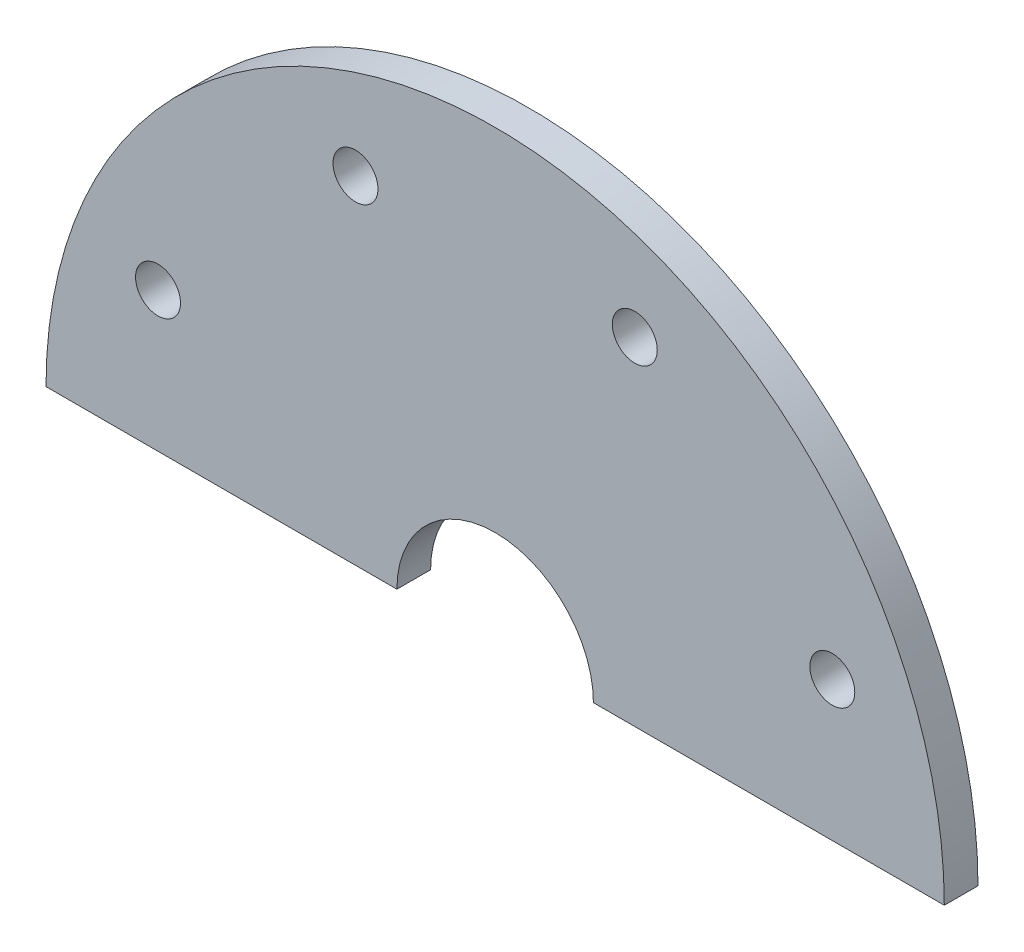
ISO-10303-21;
HEADER;
FILE_DESCRIPTION(('STEP AP214'),'2;1');
FILE_NAME('part.step','',(''),(''),'','','');
FILE_SCHEMA(('AUTOMOTIVE_DESIGN { 1 0 10303 214 1 1 1 1 }'));
ENDSEC;
DATA;
#1=APPLICATION_CONTEXT('core data for automotive mechanical design processes');
#2=APPLICATION_PROTOCOL_DEFINITION('international standard','automotive_design',2000,#1);
#3=PRODUCT_CONTEXT('',#1,'mechanical');
#4=PRODUCT('Part','Part','',(#3));
#5=PRODUCT_RELATED_PRODUCT_CATEGORY('part','',(#4));
#6=PRODUCT_DEFINITION_FORMATION('','',#4);
#7=PRODUCT_DEFINITION_CONTEXT('part definition',#1,'design');
#8=PRODUCT_DEFINITION('design','',#6,#7);
#9=PRODUCT_DEFINITION_SHAPE('','',#8);
#10=(LENGTH_UNIT() NAMED_UNIT(*) SI_UNIT(.MILLI.,.METRE.));
#11=(NAMED_UNIT(*) PLANE_ANGLE_UNIT() SI_UNIT($,.RADIAN.));
#12=(NAMED_UNIT(*) SI_UNIT($,.STERADIAN.) SOLID_ANGLE_UNIT());
#13=UNCERTAINTY_MEASURE_WITH_UNIT(LENGTH_MEASURE(1.E-05),#10,'distance_accuracy_value','');
#14=(GEOMETRIC_REPRESENTATION_CONTEXT(3) GLOBAL_UNCERTAINTY_ASSIGNED_CONTEXT((#13)) GLOBAL_UNIT_ASSIGNED_CONTEXT((#10,
#11,#12)) REPRESENTATION_CONTEXT('',''));
#15=CARTESIAN_POINT('',(0.,0.,0.));
#16=DIRECTION('',(0.,0.,1.));
#17=DIRECTION('',(1.,0.,0.));
#18=AXIS2_PLACEMENT_3D('',#15,#16,#17);
#19=CARTESIAN_POINT('',(0.,0.,6.));
#20=DIRECTION('',(0.,0.,1.));
#21=DIRECTION('',(1.,0.,0.));
#22=AXIS2_PLACEMENT_3D('',#19,#20,#21);
#23=PLANE('',#22);
#24=CARTESIAN_POINT('',(60.0521696132336,24.8744231037309,6.));
#25=DIRECTION('',(0.,0.,1.));
#26=DIRECTION('',(1.,0.,0.));
#27=AXIS2_PLACEMENT_3D('',#24,#25,#26);
#28=CIRCLE('',#27,4.);
#29=CARTESIAN_POINT('',(64.0521696132336,24.8744231037309,6.));
#30=VERTEX_POINT('',#29);
#31=EDGE_CURVE('E122',#30,#30,#28,.T.);
#32=ORIENTED_EDGE('',*,*,#31,.F.);
#33=EDGE_LOOP('',(#32));
#34=FACE_BOUND('',#33,.T.);
#35=CARTESIAN_POINT('',(-24.8744231037305,60.0521696132338,6.));
#36=DIRECTION('',(0.,0.,1.));
#37=DIRECTION('',(-1.,0.,0.));
#38=AXIS2_PLACEMENT_3D('',#35,#36,#37);
#39=CIRCLE('',#38,4.);
#40=CARTESIAN_POINT('',(-28.8744231037305,60.0521696132338,6.));
#41=VERTEX_POINT('',#40);
#42=EDGE_CURVE('E101',#41,#41,#39,.T.);
#43=ORIENTED_EDGE('',*,*,#42,.F.);
#44=EDGE_LOOP('',(#43));
#45=FACE_BOUND('',#44,.T.);
#46=CARTESIAN_POINT('',(0.,0.,6.));
#47=DIRECTION('',(0.,0.,1.));
#48=DIRECTION('',(1.,0.,0.));
#49=AXIS2_PLACEMENT_3D('',#46,#47,#48);
#50=CIRCLE('',#49,80.);
#51=CARTESIAN_POINT('',(80.,0.,6.));
#52=VERTEX_POINT('',#51);
#53=CARTESIAN_POINT('',(-80.,0.,6.));
#54=VERTEX_POINT('',#53);
#55=EDGE_CURVE('E86',#52,#54,#50,.T.);
#56=ORIENTED_EDGE('',*,*,#55,.T.);
#57=DIRECTION('',(1.,0.,0.));
#58=VECTOR('',#57,1.);
#59=CARTESIAN_POINT('',(-80.,0.,6.));
#60=LINE('',#59,#58);
#61=CARTESIAN_POINT('',(-17.5,0.,6.));
#62=VERTEX_POINT('',#61);
#63=EDGE_CURVE('E81',#54,#62,#60,.T.);
#64=ORIENTED_EDGE('',*,*,#63,.T.);
#65=CARTESIAN_POINT('',(0.,0.,6.));
#66=DIRECTION('',(0.,0.,-1.));
#67=DIRECTION('',(1.,0.,0.));
#68=AXIS2_PLACEMENT_3D('',#65,#66,#67);
#69=CIRCLE('',#68,17.5);
#70=CARTESIAN_POINT('',(17.5,0.,6.));
#71=VERTEX_POINT('',#70);
#72=EDGE_CURVE('E84',#62,#71,#69,.T.);
#73=ORIENTED_EDGE('',*,*,#72,.T.);
#74=DIRECTION('',(1.,0.,0.));
#75=VECTOR('',#74,1.);
#76=CARTESIAN_POINT('',(17.5,0.,6.));
#77=LINE('',#76,#75);
#78=EDGE_CURVE('E51',#71,#52,#77,.T.);
#79=ORIENTED_EDGE('',*,*,#78,.T.);
#80=EDGE_LOOP('',(#56,#64,#73,#79));
#81=FACE_BOUND('',#80,.T.);
#82=CARTESIAN_POINT('',(24.8744231037305,60.0521696132338,6.));
#83=DIRECTION('',(0.,0.,1.));
#84=DIRECTION('',(1.,0.,0.));
#85=AXIS2_PLACEMENT_3D('',#82,#83,#84);
#86=CIRCLE('',#85,4.);
#87=CARTESIAN_POINT('',(28.8744231037305,60.0521696132338,6.));
#88=VERTEX_POINT('',#87);
#89=EDGE_CURVE('E116',#88,#88,#86,.T.);
#90=ORIENTED_EDGE('',*,*,#89,.F.);
#91=EDGE_LOOP('',(#90));
#92=FACE_BOUND('',#91,.T.);
#93=CARTESIAN_POINT('',(-60.0521696132336,24.8744231037309,6.));
#94=DIRECTION('',(0.,0.,1.));
#95=DIRECTION('',(1.,0.,0.));
#96=AXIS2_PLACEMENT_3D('',#93,#94,#95);
#97=CIRCLE('',#96,4.00000000000001);
#98=CARTESIAN_POINT('',(-56.0521696132336,24.8744231037309,6.));
#99=VERTEX_POINT('',#98);
#100=EDGE_CURVE('E128',#99,#99,#97,.T.);
#101=ORIENTED_EDGE('',*,*,#100,.F.);
#102=EDGE_LOOP('',(#101));
#103=FACE_BOUND('',#102,.T.);
#104=ADVANCED_FACE('F34',(#34,#45,#81,#92,#103),#23,.T.);
#105=CARTESIAN_POINT('',(0.,0.,0.));
#106=DIRECTION('',(0.,0.,1.));
#107=DIRECTION('',(1.,0.,0.));
#108=AXIS2_PLACEMENT_3D('',#105,#106,#107);
#109=PLANE('',#108);
#110=CARTESIAN_POINT('',(0.,0.,0.));
#111=DIRECTION('',(0.,0.,1.));
#112=DIRECTION('',(1.,0.,0.));
#113=AXIS2_PLACEMENT_3D('',#110,#111,#112);
#114=CIRCLE('',#113,80.);
#115=CARTESIAN_POINT('',(80.,0.,0.));
#116=VERTEX_POINT('',#115);
#117=CARTESIAN_POINT('',(-80.,0.,0.));
#118=VERTEX_POINT('',#117);
#119=EDGE_CURVE('E98',#116,#118,#114,.T.);
#120=ORIENTED_EDGE('',*,*,#119,.F.);
#121=DIRECTION('',(1.,0.,0.));
#122=VECTOR('',#121,1.);
#123=CARTESIAN_POINT('',(17.5,0.,0.));
#124=LINE('',#123,#122);
#125=CARTESIAN_POINT('',(17.5,0.,0.));
#126=VERTEX_POINT('',#125);
#127=EDGE_CURVE('E74',#126,#116,#124,.T.);
#128=ORIENTED_EDGE('',*,*,#127,.F.);
#129=CARTESIAN_POINT('',(0.,0.,0.));
#130=DIRECTION('',(0.,0.,-1.));
#131=DIRECTION('',(1.,0.,0.));
#132=AXIS2_PLACEMENT_3D('',#129,#130,#131);
#133=CIRCLE('',#132,17.5);
#134=CARTESIAN_POINT('',(-17.5,0.,0.));
#135=VERTEX_POINT('',#134);
#136=EDGE_CURVE('E68',#135,#126,#133,.T.);
#137=ORIENTED_EDGE('',*,*,#136,.F.);
#138=DIRECTION('',(1.,0.,0.));
#139=VECTOR('',#138,1.);
#140=CARTESIAN_POINT('',(-80.,0.,0.));
#141=LINE('',#140,#139);
#142=EDGE_CURVE('E90',#118,#135,#141,.T.);
#143=ORIENTED_EDGE('',*,*,#142,.F.);
#144=EDGE_LOOP('',(#120,#128,#137,#143));
#145=FACE_BOUND('',#144,.T.);
#146=CARTESIAN_POINT('',(-24.8744231037305,60.0521696132338,0.));
#147=DIRECTION('',(0.,0.,1.));
#148=DIRECTION('',(-1.,0.,0.));
#149=AXIS2_PLACEMENT_3D('',#146,#147,#148);
#150=CIRCLE('',#149,4.);
#151=CARTESIAN_POINT('',(-28.8744231037305,60.0521696132338,0.));
#152=VERTEX_POINT('',#151);
#153=EDGE_CURVE('E113',#152,#152,#150,.T.);
#154=ORIENTED_EDGE('',*,*,#153,.T.);
#155=EDGE_LOOP('',(#154));
#156=FACE_BOUND('',#155,.T.);
#157=CARTESIAN_POINT('',(24.8744231037305,60.0521696132338,0.));
#158=DIRECTION('',(0.,0.,1.));
#159=DIRECTION('',(1.,0.,0.));
#160=AXIS2_PLACEMENT_3D('',#157,#158,#159);
#161=CIRCLE('',#160,4.);
#162=CARTESIAN_POINT('',(28.8744231037305,60.0521696132338,0.));
#163=VERTEX_POINT('',#162);
#164=EDGE_CURVE('E119',#163,#163,#161,.T.);
#165=ORIENTED_EDGE('',*,*,#164,.T.);
#166=EDGE_LOOP('',(#165));
#167=FACE_BOUND('',#166,.T.);
#168=CARTESIAN_POINT('',(60.0521696132336,24.8744231037309,0.));
#169=DIRECTION('',(0.,0.,1.));
#170=DIRECTION('',(1.,0.,0.));
#171=AXIS2_PLACEMENT_3D('',#168,#169,#170);
#172=CIRCLE('',#171,4.);
#173=CARTESIAN_POINT('',(64.0521696132336,24.8744231037309,0.));
#174=VERTEX_POINT('',#173);
#175=EDGE_CURVE('E125',#174,#174,#172,.T.);
#176=ORIENTED_EDGE('',*,*,#175,.T.);
#177=EDGE_LOOP('',(#176));
#178=FACE_BOUND('',#177,.T.);
#179=CARTESIAN_POINT('',(-60.0521696132336,24.8744231037309,0.));
#180=DIRECTION('',(0.,0.,1.));
#181=DIRECTION('',(1.,0.,0.));
#182=AXIS2_PLACEMENT_3D('',#179,#180,#181);
#183=CIRCLE('',#182,4.00000000000001);
#184=CARTESIAN_POINT('',(-56.0521696132336,24.8744231037309,0.));
#185=VERTEX_POINT('',#184);
#186=EDGE_CURVE('E131',#185,#185,#183,.T.);
#187=ORIENTED_EDGE('',*,*,#186,.T.);
#188=EDGE_LOOP('',(#187));
#189=FACE_BOUND('',#188,.T.);
#190=ADVANCED_FACE('F109',(#145,#156,#167,#178,#189),#109,.F.);
#191=CARTESIAN_POINT('',(0.,0.,6.));
#192=DIRECTION('',(0.,0.,-1.));
#193=DIRECTION('',(-1.,0.,0.));
#194=AXIS2_PLACEMENT_3D('',#191,#192,#193);
#195=CYLINDRICAL_SURFACE('',#194,80.);
#196=ORIENTED_EDGE('',*,*,#119,.T.);
#197=DIRECTION('',(0.,0.,-1.));
#198=VECTOR('',#197,1.);
#199=CARTESIAN_POINT('',(-80.,0.,6.));
#200=LINE('',#199,#198);
#201=EDGE_CURVE('E11',#54,#118,#200,.T.);
#202=ORIENTED_EDGE('',*,*,#201,.F.);
#203=ORIENTED_EDGE('',*,*,#55,.F.);
#204=DIRECTION('',(0.,0.,-1.));
#205=VECTOR('',#204,1.);
#206=CARTESIAN_POINT('',(80.,0.,6.));
#207=LINE('',#206,#205);
#208=EDGE_CURVE('E94',#52,#116,#207,.T.);
#209=ORIENTED_EDGE('',*,*,#208,.T.);
#210=EDGE_LOOP('',(#196,#202,#203,#209));
#211=FACE_BOUND('',#210,.T.);
#212=ADVANCED_FACE('F36',(#211),#195,.T.);
#213=CARTESIAN_POINT('',(-80.,0.,6.));
#214=DIRECTION('',(0.,1.,0.));
#215=DIRECTION('',(0.,0.,1.));
#216=AXIS2_PLACEMENT_3D('',#213,#214,#215);
#217=PLANE('',#216);
#218=ORIENTED_EDGE('',*,*,#142,.T.);
#219=DIRECTION('',(0.,0.,-1.));
#220=VECTOR('',#219,1.);
#221=CARTESIAN_POINT('',(-17.5,0.,6.));
#222=LINE('',#221,#220);
#223=EDGE_CURVE('E43',#62,#135,#222,.T.);
#224=ORIENTED_EDGE('',*,*,#223,.F.);
#225=ORIENTED_EDGE('',*,*,#63,.F.);
#226=ORIENTED_EDGE('',*,*,#201,.T.);
#227=EDGE_LOOP('',(#218,#224,#225,#226));
#228=FACE_BOUND('',#227,.T.);
#229=ADVANCED_FACE('F89',(#228),#217,.F.);
#230=CARTESIAN_POINT('',(0.,0.,6.));
#231=DIRECTION('',(0.,0.,-1.));
#232=DIRECTION('',(-1.,0.,0.));
#233=AXIS2_PLACEMENT_3D('',#230,#231,#232);
#234=CYLINDRICAL_SURFACE('',#233,17.5);
#235=ORIENTED_EDGE('',*,*,#136,.T.);
#236=DIRECTION('',(0.,0.,-1.));
#237=VECTOR('',#236,1.);
#238=CARTESIAN_POINT('',(17.5,0.,6.));
#239=LINE('',#238,#237);
#240=EDGE_CURVE('E91',#71,#126,#239,.T.);
#241=ORIENTED_EDGE('',*,*,#240,.F.);
#242=ORIENTED_EDGE('',*,*,#72,.F.);
#243=ORIENTED_EDGE('',*,*,#223,.T.);
#244=EDGE_LOOP('',(#235,#241,#242,#243));
#245=FACE_BOUND('',#244,.T.);
#246=ADVANCED_FACE('F92',(#245),#234,.F.);
#247=CARTESIAN_POINT('',(17.5,0.,6.));
#248=DIRECTION('',(0.,1.,0.));
#249=DIRECTION('',(0.,0.,1.));
#250=AXIS2_PLACEMENT_3D('',#247,#248,#249);
#251=PLANE('',#250);
#252=ORIENTED_EDGE('',*,*,#127,.T.);
#253=ORIENTED_EDGE('',*,*,#208,.F.);
#254=ORIENTED_EDGE('',*,*,#78,.F.);
#255=ORIENTED_EDGE('',*,*,#240,.T.);
#256=EDGE_LOOP('',(#252,#253,#254,#255));
#257=FACE_BOUND('',#256,.T.);
#258=ADVANCED_FACE('F106',(#257),#251,.F.);
#259=CARTESIAN_POINT('',(-24.8744231037305,60.0521696132338,6.));
#260=DIRECTION('',(0.,0.,-1.));
#261=DIRECTION('',(-1.,0.,0.));
#262=AXIS2_PLACEMENT_3D('',#259,#260,#261);
#263=CYLINDRICAL_SURFACE('',#262,4.);
#264=ORIENTED_EDGE('',*,*,#42,.T.);
#265=EDGE_LOOP('',(#264));
#266=FACE_BOUND('',#265,.T.);
#267=ORIENTED_EDGE('',*,*,#153,.F.);
#268=EDGE_LOOP('',(#267));
#269=FACE_BOUND('',#268,.T.);
#270=ADVANCED_FACE('F150',(#266,#269),#263,.F.);
#271=CARTESIAN_POINT('',(24.8744231037305,60.0521696132338,6.));
#272=DIRECTION('',(0.,0.,-1.));
#273=DIRECTION('',(-1.,0.,0.));
#274=AXIS2_PLACEMENT_3D('',#271,#272,#273);
#275=CYLINDRICAL_SURFACE('',#274,4.);
#276=ORIENTED_EDGE('',*,*,#89,.T.);
#277=EDGE_LOOP('',(#276));
#278=FACE_BOUND('',#277,.T.);
#279=ORIENTED_EDGE('',*,*,#164,.F.);
#280=EDGE_LOOP('',(#279));
#281=FACE_BOUND('',#280,.T.);
#282=ADVANCED_FACE('F196',(#278,#281),#275,.F.);
#283=CARTESIAN_POINT('',(60.0521696132336,24.8744231037309,6.));
#284=DIRECTION('',(0.,0.,-1.));
#285=DIRECTION('',(-1.,0.,0.));
#286=AXIS2_PLACEMENT_3D('',#283,#284,#285);
#287=CYLINDRICAL_SURFACE('',#286,4.);
#288=ORIENTED_EDGE('',*,*,#31,.T.);
#289=EDGE_LOOP('',(#288));
#290=FACE_BOUND('',#289,.T.);
#291=ORIENTED_EDGE('',*,*,#175,.F.);
#292=EDGE_LOOP('',(#291));
#293=FACE_BOUND('',#292,.T.);
#294=ADVANCED_FACE('F204',(#290,#293),#287,.F.);
#295=CARTESIAN_POINT('',(-60.0521696132336,24.8744231037309,6.));
#296=DIRECTION('',(0.,0.,-1.));
#297=DIRECTION('',(-1.,0.,0.));
#298=AXIS2_PLACEMENT_3D('',#295,#296,#297);
#299=CYLINDRICAL_SURFACE('',#298,4.00000000000001);
#300=ORIENTED_EDGE('',*,*,#100,.T.);
#301=EDGE_LOOP('',(#300));
#302=FACE_BOUND('',#301,.T.);
#303=ORIENTED_EDGE('',*,*,#186,.F.);
#304=EDGE_LOOP('',(#303));
#305=FACE_BOUND('',#304,.T.);
#306=ADVANCED_FACE('F137',(#302,#305),#299,.F.);
#307=CLOSED_SHELL('',(#104,#190,#212,#229,#246,#258,#270,#282,#294,#306));
#308=MANIFOLD_SOLID_BREP('B2',#307);
#309=ADVANCED_BREP_SHAPE_REPRESENTATION('',(#18,#308),#14);
#310=SHAPE_DEFINITION_REPRESENTATION(#9,#309);
ENDSEC;
END-ISO-10303-21;
